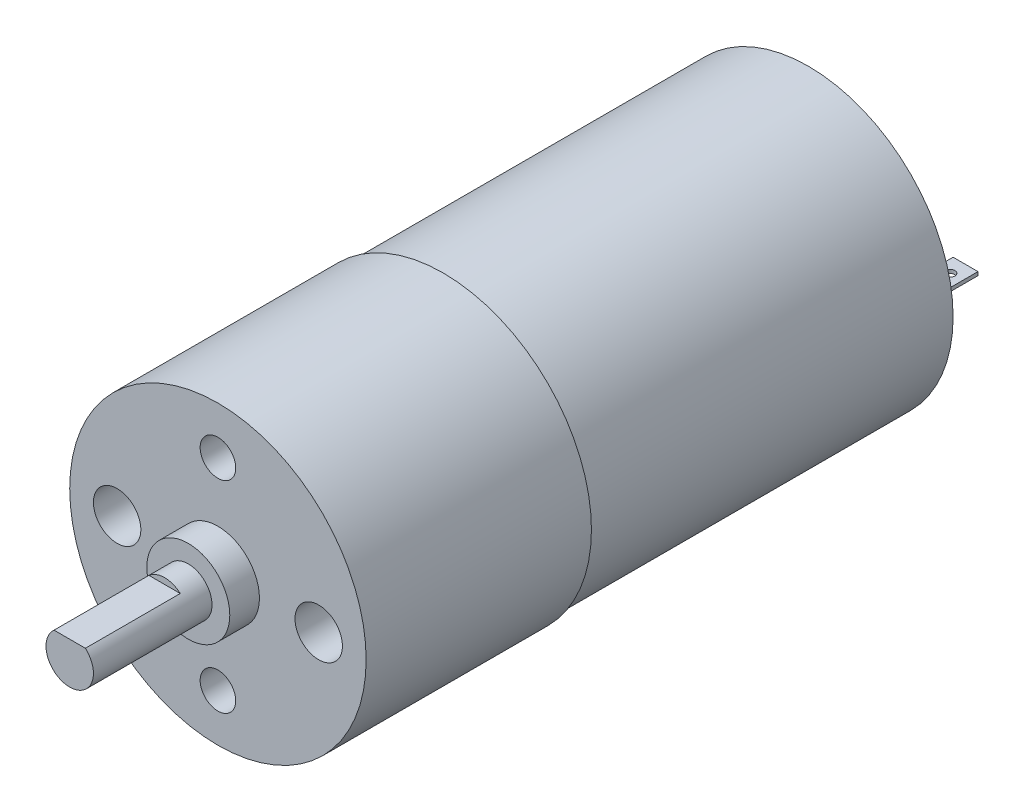
ISO-10303-21;
HEADER;
FILE_DESCRIPTION(('STEP AP214'),'2;1');
FILE_NAME('part.step','',(''),(''),'','','');
FILE_SCHEMA(('AUTOMOTIVE_DESIGN { 1 0 10303 214 1 1 1 1 }'));
ENDSEC;
DATA;
#1=APPLICATION_CONTEXT('core data for automotive mechanical design processes');
#2=APPLICATION_PROTOCOL_DEFINITION('international standard','automotive_design',2000,#1);
#3=PRODUCT_CONTEXT('',#1,'mechanical');
#4=PRODUCT('Part','Part','',(#3));
#5=PRODUCT_RELATED_PRODUCT_CATEGORY('part','',(#4));
#6=PRODUCT_DEFINITION_FORMATION('','',#4);
#7=PRODUCT_DEFINITION_CONTEXT('part definition',#1,'design');
#8=PRODUCT_DEFINITION('design','',#6,#7);
#9=PRODUCT_DEFINITION_SHAPE('','',#8);
#10=(LENGTH_UNIT() NAMED_UNIT(*) SI_UNIT(.MILLI.,.METRE.));
#11=(NAMED_UNIT(*) PLANE_ANGLE_UNIT() SI_UNIT($,.RADIAN.));
#12=(NAMED_UNIT(*) SI_UNIT($,.STERADIAN.) SOLID_ANGLE_UNIT());
#13=UNCERTAINTY_MEASURE_WITH_UNIT(LENGTH_MEASURE(1.E-05),#10,'distance_accuracy_value','');
#14=(GEOMETRIC_REPRESENTATION_CONTEXT(3) GLOBAL_UNCERTAINTY_ASSIGNED_CONTEXT((#13)) GLOBAL_UNIT_ASSIGNED_CONTEXT((#10,
#11,#12)) REPRESENTATION_CONTEXT('',''));
#15=CARTESIAN_POINT('',(0.,0.,0.));
#16=DIRECTION('',(0.,0.,1.));
#17=DIRECTION('',(1.,0.,0.));
#18=AXIS2_PLACEMENT_3D('',#15,#16,#17);
#19=CARTESIAN_POINT('',(0.,0.,-31.8));
#20=DIRECTION('',(0.,0.,1.));
#21=DIRECTION('',(1.,0.,0.));
#22=AXIS2_PLACEMENT_3D('',#19,#20,#21);
#23=CYLINDRICAL_SURFACE('',#22,3.2);
#24=CARTESIAN_POINT('',(0.,0.,-31.8));
#25=DIRECTION('',(0.,0.,-1.));
#26=DIRECTION('',(-1.,0.,0.));
#27=AXIS2_PLACEMENT_3D('',#24,#25,#26);
#28=CIRCLE('',#27,3.2);
#29=CARTESIAN_POINT('',(-3.2,0.,-31.8));
#30=VERTEX_POINT('',#29);
#31=EDGE_CURVE('E11',#30,#30,#28,.T.);
#32=ORIENTED_EDGE('',*,*,#31,.F.);
#33=EDGE_LOOP('',(#32));
#34=FACE_BOUND('',#33,.T.);
#35=CARTESIAN_POINT('',(0.,0.,-30.8));
#36=DIRECTION('',(0.,0.,-1.));
#37=DIRECTION('',(-1.,0.,0.));
#38=AXIS2_PLACEMENT_3D('',#35,#36,#37);
#39=CIRCLE('',#38,3.2);
#40=CARTESIAN_POINT('',(-3.2,0.,-30.8));
#41=VERTEX_POINT('',#40);
#42=EDGE_CURVE('E60',#41,#41,#39,.T.);
#43=ORIENTED_EDGE('',*,*,#42,.T.);
#44=EDGE_LOOP('',(#43));
#45=FACE_BOUND('',#44,.T.);
#46=ADVANCED_FACE('F57',(#34,#45),#23,.T.);
#47=CARTESIAN_POINT('',(0.,0.,-30.8));
#48=DIRECTION('',(0.,0.,-1.));
#49=DIRECTION('',(-1.,0.,0.));
#50=AXIS2_PLACEMENT_3D('',#47,#48,#49);
#51=PLANE('',#50);
#52=ORIENTED_EDGE('',*,*,#42,.F.);
#53=EDGE_LOOP('',(#52));
#54=FACE_BOUND('',#53,.T.);
#55=ADVANCED_FACE('F76',(#54),#51,.F.);
#56=CARTESIAN_POINT('',(0.,0.,-31.8));
#57=DIRECTION('',(0.,0.,1.));
#58=DIRECTION('',(-1.,0.,0.));
#59=AXIS2_PLACEMENT_3D('',#56,#57,#58);
#60=CONICAL_SURFACE('',#59,3.2,0.401425727958696);
#61=CARTESIAN_POINT('',(0.,0.,-32.3));
#62=DIRECTION('',(0.,0.,-1.));
#63=DIRECTION('',(-1.,0.,0.));
#64=AXIS2_PLACEMENT_3D('',#61,#62,#63);
#65=CIRCLE('',#64,2.9877625918952);
#66=CARTESIAN_POINT('',(-2.9877625918952,0.,-32.3));
#67=VERTEX_POINT('',#66);
#68=EDGE_CURVE('E67',#67,#67,#65,.T.);
#69=ORIENTED_EDGE('',*,*,#68,.F.);
#70=EDGE_LOOP('',(#69));
#71=FACE_BOUND('',#70,.T.);
#72=ORIENTED_EDGE('',*,*,#31,.T.);
#73=EDGE_LOOP('',(#72));
#74=FACE_BOUND('',#73,.T.);
#75=ADVANCED_FACE('F74',(#71,#74),#60,.T.);
#76=CARTESIAN_POINT('',(0.,0.,-32.3));
#77=DIRECTION('',(0.,0.,-1.));
#78=DIRECTION('',(-1.,0.,0.));
#79=AXIS2_PLACEMENT_3D('',#76,#77,#78);
#80=PLANE('',#79);
#81=ORIENTED_EDGE('',*,*,#68,.T.);
#82=EDGE_LOOP('',(#81));
#83=FACE_BOUND('',#82,.T.);
#84=ADVANCED_FACE('F72',(#83),#80,.T.);
#85=CLOSED_SHELL('',(#46,#55,#75,#84));
#86=MANIFOLD_SOLID_BREP('B2',#85);
#87=CARTESIAN_POINT('',(0.,0.,-30.8));
#88=DIRECTION('',(0.,0.,-1.));
#89=DIRECTION('',(-1.,0.,0.));
#90=AXIS2_PLACEMENT_3D('',#87,#88,#89);
#91=PLANE('',#90);
#92=CARTESIAN_POINT('',(0.,0.,-30.8));
#93=DIRECTION('',(0.,0.,-1.));
#94=DIRECTION('',(-1.,0.,0.));
#95=AXIS2_PLACEMENT_3D('',#92,#93,#94);
#96=CIRCLE('',#95,12.2);
#97=CARTESIAN_POINT('',(12.2,0.,-30.8));
#98=VERTEX_POINT('',#97);
#99=EDGE_CURVE('E313',#98,#98,#96,.T.);
#100=ORIENTED_EDGE('',*,*,#99,.T.);
#101=EDGE_LOOP('',(#100));
#102=FACE_BOUND('',#101,.T.);
#103=CARTESIAN_POINT('',(0.,0.,-30.8));
#104=DIRECTION('',(0.,0.,-1.));
#105=DIRECTION('',(-1.,0.,0.));
#106=AXIS2_PLACEMENT_3D('',#103,#104,#105);
#107=CIRCLE('',#106,3.2);
#108=CARTESIAN_POINT('',(-3.2,0.,-30.8));
#109=VERTEX_POINT('',#108);
#110=EDGE_CURVE('E310',#109,#109,#107,.T.);
#111=ORIENTED_EDGE('',*,*,#110,.F.);
#112=EDGE_LOOP('',(#111));
#113=FACE_BOUND('',#112,.T.);
#114=DIRECTION('',(1.,0.,0.));
#115=VECTOR('',#114,1.);
#116=CARTESIAN_POINT('',(10.1,0.15,-30.8));
#117=LINE('',#116,#115);
#118=CARTESIAN_POINT('',(8.,0.15,-30.8));
#119=VERTEX_POINT('',#118);
#120=CARTESIAN_POINT('',(10.1,0.15,-30.8));
#121=VERTEX_POINT('',#120);
#122=EDGE_CURVE('E295',#119,#121,#117,.T.);
#123=ORIENTED_EDGE('',*,*,#122,.F.);
#124=DIRECTION('',(0.,1.,0.));
#125=VECTOR('',#124,1.);
#126=CARTESIAN_POINT('',(8.,-0.15,-30.8));
#127=LINE('',#126,#125);
#128=CARTESIAN_POINT('',(8.,-0.15,-30.8));
#129=VERTEX_POINT('',#128);
#130=EDGE_CURVE('E274',#129,#119,#127,.T.);
#131=ORIENTED_EDGE('',*,*,#130,.F.);
#132=DIRECTION('',(-1.,0.,0.));
#133=VECTOR('',#132,1.);
#134=CARTESIAN_POINT('',(10.1,-0.15,-30.8));
#135=LINE('',#134,#133);
#136=CARTESIAN_POINT('',(10.1,-0.15,-30.8));
#137=VERTEX_POINT('',#136);
#138=EDGE_CURVE('E286',#137,#129,#135,.T.);
#139=ORIENTED_EDGE('',*,*,#138,.F.);
#140=DIRECTION('',(0.,-1.,0.));
#141=VECTOR('',#140,1.);
#142=CARTESIAN_POINT('',(10.1,-0.15,-30.8));
#143=LINE('',#142,#141);
#144=EDGE_CURVE('E297',#121,#137,#143,.T.);
#145=ORIENTED_EDGE('',*,*,#144,.F.);
#146=EDGE_LOOP('',(#123,#131,#139,#145));
#147=FACE_BOUND('',#146,.T.);
#148=DIRECTION('',(1.,0.,0.));
#149=VECTOR('',#148,1.);
#150=CARTESIAN_POINT('',(-10.1,0.15,-30.8));
#151=LINE('',#150,#149);
#152=CARTESIAN_POINT('',(-10.1,0.15,-30.8));
#153=VERTEX_POINT('',#152);
#154=CARTESIAN_POINT('',(-8.,0.15,-30.8));
#155=VERTEX_POINT('',#154);
#156=EDGE_CURVE('E269',#153,#155,#151,.T.);
#157=ORIENTED_EDGE('',*,*,#156,.F.);
#158=DIRECTION('',(0.,1.,0.));
#159=VECTOR('',#158,1.);
#160=CARTESIAN_POINT('',(-10.1,-0.149999999999998,-30.8));
#161=LINE('',#160,#159);
#162=CARTESIAN_POINT('',(-10.1,-0.149999999999998,-30.8));
#163=VERTEX_POINT('',#162);
#164=EDGE_CURVE('E271',#163,#153,#161,.T.);
#165=ORIENTED_EDGE('',*,*,#164,.F.);
#166=DIRECTION('',(-1.,0.,0.));
#167=VECTOR('',#166,1.);
#168=CARTESIAN_POINT('',(-10.1,-0.149999999999998,-30.8));
#169=LINE('',#168,#167);
#170=CARTESIAN_POINT('',(-8.00000000000001,-0.149999999999998,-30.8));
#171=VERTEX_POINT('',#170);
#172=EDGE_CURVE('E264',#171,#163,#169,.T.);
#173=ORIENTED_EDGE('',*,*,#172,.F.);
#174=DIRECTION('',(0.,-1.,0.));
#175=VECTOR('',#174,1.);
#176=CARTESIAN_POINT('',(-8.00000000000001,-0.149999999999998,-30.8));
#177=LINE('',#176,#175);
#178=EDGE_CURVE('E266',#155,#171,#177,.T.);
#179=ORIENTED_EDGE('',*,*,#178,.F.);
#180=EDGE_LOOP('',(#157,#165,#173,#179));
#181=FACE_BOUND('',#180,.T.);
#182=ADVANCED_FACE('F141',(#102,#113,#147,#181),#91,.T.);
#183=CARTESIAN_POINT('',(0.,0.,19.));
#184=DIRECTION('',(0.,0.,1.));
#185=DIRECTION('',(1.,0.,0.));
#186=AXIS2_PLACEMENT_3D('',#183,#184,#185);
#187=PLANE('',#186);
#188=CARTESIAN_POINT('',(-8.5,0.,19.));
#189=DIRECTION('',(0.,0.,1.));
#190=DIRECTION('',(1.,0.,0.));
#191=AXIS2_PLACEMENT_3D('',#188,#189,#190);
#192=CIRCLE('',#191,2.);
#193=CARTESIAN_POINT('',(-6.5,0.,19.));
#194=VERTEX_POINT('',#193);
#195=EDGE_CURVE('E352',#194,#194,#192,.T.);
#196=ORIENTED_EDGE('',*,*,#195,.F.);
#197=EDGE_LOOP('',(#196));
#198=FACE_BOUND('',#197,.T.);
#199=CARTESIAN_POINT('',(8.5,0.,19.));
#200=DIRECTION('',(0.,0.,1.));
#201=DIRECTION('',(-1.,0.,0.));
#202=AXIS2_PLACEMENT_3D('',#199,#200,#201);
#203=CIRCLE('',#202,2.);
#204=CARTESIAN_POINT('',(6.5,0.,19.));
#205=VERTEX_POINT('',#204);
#206=EDGE_CURVE('E339',#205,#205,#203,.T.);
#207=ORIENTED_EDGE('',*,*,#206,.F.);
#208=EDGE_LOOP('',(#207));
#209=FACE_BOUND('',#208,.T.);
#210=CARTESIAN_POINT('',(0.,0.,19.));
#211=DIRECTION('',(0.,0.,1.));
#212=DIRECTION('',(1.,0.,0.));
#213=AXIS2_PLACEMENT_3D('',#210,#211,#212);
#214=CIRCLE('',#213,3.5);
#215=CARTESIAN_POINT('',(3.5,0.,19.));
#216=VERTEX_POINT('',#215);
#217=EDGE_CURVE('E245',#216,#216,#214,.T.);
#218=ORIENTED_EDGE('',*,*,#217,.F.);
#219=EDGE_LOOP('',(#218));
#220=FACE_BOUND('',#219,.T.);
#221=CARTESIAN_POINT('',(0.,8.5,19.));
#222=DIRECTION('',(0.,0.,1.));
#223=DIRECTION('',(1.,0.,0.));
#224=AXIS2_PLACEMENT_3D('',#221,#222,#223);
#225=CIRCLE('',#224,1.5);
#226=CARTESIAN_POINT('',(1.5,8.5,19.));
#227=VERTEX_POINT('',#226);
#228=EDGE_CURVE('E323',#227,#227,#225,.T.);
#229=ORIENTED_EDGE('',*,*,#228,.F.);
#230=EDGE_LOOP('',(#229));
#231=FACE_BOUND('',#230,.T.);
#232=CARTESIAN_POINT('',(0.,0.,19.));
#233=DIRECTION('',(0.,0.,1.));
#234=DIRECTION('',(1.,0.,0.));
#235=AXIS2_PLACEMENT_3D('',#232,#233,#234);
#236=CIRCLE('',#235,12.5);
#237=CARTESIAN_POINT('',(12.5,0.,19.));
#238=VERTEX_POINT('',#237);
#239=EDGE_CURVE('E150',#238,#238,#236,.T.);
#240=ORIENTED_EDGE('',*,*,#239,.T.);
#241=EDGE_LOOP('',(#240));
#242=FACE_BOUND('',#241,.T.);
#243=CARTESIAN_POINT('',(0.,-8.5,19.));
#244=DIRECTION('',(0.,0.,1.));
#245=DIRECTION('',(-1.,0.,0.));
#246=AXIS2_PLACEMENT_3D('',#243,#244,#245);
#247=CIRCLE('',#246,1.5);
#248=CARTESIAN_POINT('',(-1.5,-8.5,19.));
#249=VERTEX_POINT('',#248);
#250=EDGE_CURVE('E317',#249,#249,#247,.T.);
#251=ORIENTED_EDGE('',*,*,#250,.F.);
#252=EDGE_LOOP('',(#251));
#253=FACE_BOUND('',#252,.T.);
#254=ADVANCED_FACE('F368',(#198,#209,#220,#231,#242,#253),#187,.T.);
#255=CARTESIAN_POINT('',(0.,0.,0.));
#256=DIRECTION('',(0.,0.,1.));
#257=DIRECTION('',(1.,0.,0.));
#258=AXIS2_PLACEMENT_3D('',#255,#256,#257);
#259=PLANE('',#258);
#260=CARTESIAN_POINT('',(0.,0.,0.));
#261=DIRECTION('',(0.,0.,-1.));
#262=DIRECTION('',(-1.,0.,0.));
#263=AXIS2_PLACEMENT_3D('',#260,#261,#262);
#264=CIRCLE('',#263,12.2);
#265=CARTESIAN_POINT('',(12.2,0.,0.));
#266=VERTEX_POINT('',#265);
#267=EDGE_CURVE('E55',#266,#266,#264,.T.);
#268=ORIENTED_EDGE('',*,*,#267,.F.);
#269=EDGE_LOOP('',(#268));
#270=FACE_BOUND('',#269,.T.);
#271=CARTESIAN_POINT('',(0.,0.,0.));
#272=DIRECTION('',(0.,0.,1.));
#273=DIRECTION('',(1.,0.,0.));
#274=AXIS2_PLACEMENT_3D('',#271,#272,#273);
#275=CIRCLE('',#274,12.5);
#276=CARTESIAN_POINT('',(12.5,0.,0.));
#277=VERTEX_POINT('',#276);
#278=EDGE_CURVE('E326',#277,#277,#275,.T.);
#279=ORIENTED_EDGE('',*,*,#278,.F.);
#280=EDGE_LOOP('',(#279));
#281=FACE_BOUND('',#280,.T.);
#282=ADVANCED_FACE('F374',(#270,#281),#259,.F.);
#283=CARTESIAN_POINT('',(0.,0.,19.));
#284=DIRECTION('',(0.,0.,-1.));
#285=DIRECTION('',(-1.,0.,0.));
#286=AXIS2_PLACEMENT_3D('',#283,#284,#285);
#287=CYLINDRICAL_SURFACE('',#286,12.5);
#288=ORIENTED_EDGE('',*,*,#239,.F.);
#289=EDGE_LOOP('',(#288));
#290=FACE_BOUND('',#289,.T.);
#291=ORIENTED_EDGE('',*,*,#278,.T.);
#292=EDGE_LOOP('',(#291));
#293=FACE_BOUND('',#292,.T.);
#294=ADVANCED_FACE('F143',(#290,#293),#287,.T.);
#295=CARTESIAN_POINT('',(0.,0.,19.));
#296=DIRECTION('',(0.,0.,-1.));
#297=DIRECTION('',(-1.,0.,0.));
#298=AXIS2_PLACEMENT_3D('',#295,#296,#297);
#299=CYLINDRICAL_SURFACE('',#298,3.2);
#300=CARTESIAN_POINT('',(0.,0.,19.));
#301=DIRECTION('',(0.,0.,1.));
#302=DIRECTION('',(1.,0.,0.));
#303=AXIS2_PLACEMENT_3D('',#300,#301,#302);
#304=CIRCLE('',#303,3.2);
#305=CARTESIAN_POINT('',(3.2,0.,19.));
#306=VERTEX_POINT('',#305);
#307=EDGE_CURVE('E249',#306,#306,#304,.T.);
#308=ORIENTED_EDGE('',*,*,#307,.T.);
#309=EDGE_LOOP('',(#308));
#310=FACE_BOUND('',#309,.T.);
#311=ORIENTED_EDGE('',*,*,#110,.T.);
#312=EDGE_LOOP('',(#311));
#313=FACE_BOUND('',#312,.T.);
#314=ADVANCED_FACE('F398',(#310,#313),#299,.F.);
#315=CARTESIAN_POINT('',(0.,8.5,19.));
#316=DIRECTION('',(0.,0.,-1.));
#317=DIRECTION('',(-1.,0.,0.));
#318=AXIS2_PLACEMENT_3D('',#315,#316,#317);
#319=CYLINDRICAL_SURFACE('',#318,1.5);
#320=ORIENTED_EDGE('',*,*,#228,.T.);
#321=EDGE_LOOP('',(#320));
#322=FACE_BOUND('',#321,.T.);
#323=CARTESIAN_POINT('',(0.,8.5,0.));
#324=DIRECTION('',(0.,0.,1.));
#325=DIRECTION('',(1.,0.,0.));
#326=AXIS2_PLACEMENT_3D('',#323,#324,#325);
#327=CIRCLE('',#326,1.5);
#328=CARTESIAN_POINT('',(1.5,8.5,0.));
#329=VERTEX_POINT('',#328);
#330=EDGE_CURVE('E320',#329,#329,#327,.T.);
#331=ORIENTED_EDGE('',*,*,#330,.F.);
#332=EDGE_LOOP('',(#331));
#333=FACE_BOUND('',#332,.T.);
#334=ADVANCED_FACE('F394',(#322,#333),#319,.F.);
#335=CARTESIAN_POINT('',(0.,-8.5,19.));
#336=DIRECTION('',(0.,0.,-1.));
#337=DIRECTION('',(-1.,0.,0.));
#338=AXIS2_PLACEMENT_3D('',#335,#336,#337);
#339=CYLINDRICAL_SURFACE('',#338,1.5);
#340=ORIENTED_EDGE('',*,*,#250,.T.);
#341=EDGE_LOOP('',(#340));
#342=FACE_BOUND('',#341,.T.);
#343=CARTESIAN_POINT('',(0.,-8.5,0.));
#344=DIRECTION('',(0.,0.,1.));
#345=DIRECTION('',(-1.,0.,0.));
#346=AXIS2_PLACEMENT_3D('',#343,#344,#345);
#347=CIRCLE('',#346,1.5);
#348=CARTESIAN_POINT('',(-1.5,-8.5,0.));
#349=VERTEX_POINT('',#348);
#350=EDGE_CURVE('E315',#349,#349,#347,.T.);
#351=ORIENTED_EDGE('',*,*,#350,.F.);
#352=EDGE_LOOP('',(#351));
#353=FACE_BOUND('',#352,.T.);
#354=ADVANCED_FACE('F390',(#342,#353),#339,.F.);
#355=CARTESIAN_POINT('',(0.,0.,-30.8));
#356=DIRECTION('',(0.,0.,1.));
#357=DIRECTION('',(1.,0.,0.));
#358=AXIS2_PLACEMENT_3D('',#355,#356,#357);
#359=CYLINDRICAL_SURFACE('',#358,12.2);
#360=CARTESIAN_POINT('',(12.2,0.,-30.8));
#361=CARTESIAN_POINT('',(12.2,0.,-30.4791666666667));
#362=CARTESIAN_POINT('',(12.2,0.,-30.1583333333333));
#363=CARTESIAN_POINT('',(12.2,0.,-29.5166666666667));
#364=CARTESIAN_POINT('',(12.2,0.,-29.1958333333333));
#365=CARTESIAN_POINT('',(12.2,0.,-28.5541666666667));
#366=CARTESIAN_POINT('',(12.2,0.,-28.2333333333333));
#367=CARTESIAN_POINT('',(12.2,0.,-27.5916666666667));
#368=CARTESIAN_POINT('',(12.2,0.,-27.2708333333333));
#369=CARTESIAN_POINT('',(12.2,0.,-26.6291666666667));
#370=CARTESIAN_POINT('',(12.2,0.,-26.3083333333333));
#371=CARTESIAN_POINT('',(12.2,0.,-25.6666666666667));
#372=CARTESIAN_POINT('',(12.2,0.,-25.3458333333333));
#373=CARTESIAN_POINT('',(12.2,0.,-24.7041666666667));
#374=CARTESIAN_POINT('',(12.2,0.,-24.3833333333333));
#375=CARTESIAN_POINT('',(12.2,0.,-23.7416666666667));
#376=CARTESIAN_POINT('',(12.2,0.,-23.4208333333333));
#377=CARTESIAN_POINT('',(12.2,0.,-22.7791666666667));
#378=CARTESIAN_POINT('',(12.2,0.,-22.4583333333333));
#379=CARTESIAN_POINT('',(12.2,0.,-21.8166666666667));
#380=CARTESIAN_POINT('',(12.2,0.,-21.4958333333333));
#381=CARTESIAN_POINT('',(12.2,0.,-20.8541666666667));
#382=CARTESIAN_POINT('',(12.2,0.,-20.5333333333333));
#383=CARTESIAN_POINT('',(12.2,0.,-19.8916666666667));
#384=CARTESIAN_POINT('',(12.2,0.,-19.5708333333333));
#385=CARTESIAN_POINT('',(12.2,0.,-18.9291666666667));
#386=CARTESIAN_POINT('',(12.2,0.,-18.6083333333333));
#387=CARTESIAN_POINT('',(12.2,0.,-17.9666666666667));
#388=CARTESIAN_POINT('',(12.2,0.,-17.6458333333333));
#389=CARTESIAN_POINT('',(12.2,0.,-17.0041666666667));
#390=CARTESIAN_POINT('',(12.2,0.,-16.6833333333333));
#391=CARTESIAN_POINT('',(12.2,0.,-16.0416666666667));
#392=CARTESIAN_POINT('',(12.2,0.,-15.7208333333333));
#393=CARTESIAN_POINT('',(12.2,0.,-15.0791666666667));
#394=CARTESIAN_POINT('',(12.2,0.,-14.7583333333333));
#395=CARTESIAN_POINT('',(12.2,0.,-14.1166666666667));
#396=CARTESIAN_POINT('',(12.2,0.,-13.7958333333333));
#397=CARTESIAN_POINT('',(12.2,0.,-13.1541666666667));
#398=CARTESIAN_POINT('',(12.2,0.,-12.8333333333333));
#399=CARTESIAN_POINT('',(12.2,0.,-12.1916666666667));
#400=CARTESIAN_POINT('',(12.2,0.,-11.8708333333333));
#401=CARTESIAN_POINT('',(12.2,0.,-11.2291666666667));
#402=CARTESIAN_POINT('',(12.2,0.,-10.9083333333333));
#403=CARTESIAN_POINT('',(12.2,0.,-10.2666666666667));
#404=CARTESIAN_POINT('',(12.2,0.,-9.94583333333333));
#405=CARTESIAN_POINT('',(12.2,0.,-9.30416666666667));
#406=CARTESIAN_POINT('',(12.2,0.,-8.98333333333333));
#407=CARTESIAN_POINT('',(12.2,0.,-8.34166666666667));
#408=CARTESIAN_POINT('',(12.2,0.,-8.02083333333333));
#409=CARTESIAN_POINT('',(12.2,0.,-7.37916666666666));
#410=CARTESIAN_POINT('',(12.2,0.,-7.05833333333333));
#411=CARTESIAN_POINT('',(12.2,0.,-6.41666666666666));
#412=CARTESIAN_POINT('',(12.2,0.,-6.09583333333333));
#413=CARTESIAN_POINT('',(12.2,0.,-5.45416666666667));
#414=CARTESIAN_POINT('',(12.2,0.,-5.13333333333333));
#415=CARTESIAN_POINT('',(12.2,0.,-4.49166666666666));
#416=CARTESIAN_POINT('',(12.2,0.,-4.17083333333333));
#417=CARTESIAN_POINT('',(12.2,0.,-3.52916666666666));
#418=CARTESIAN_POINT('',(12.2,0.,-3.20833333333333));
#419=CARTESIAN_POINT('',(12.2,0.,-2.56666666666666));
#420=CARTESIAN_POINT('',(12.2,0.,-2.24583333333333));
#421=CARTESIAN_POINT('',(12.2,0.,-1.60416666666666));
#422=CARTESIAN_POINT('',(12.2,0.,-1.28333333333333));
#423=CARTESIAN_POINT('',(12.2,0.,-0.641666666666664));
#424=CARTESIAN_POINT('',(12.2,0.,-0.32083333333333));
#425=CARTESIAN_POINT('',(12.2,0.,0.));
#426=B_SPLINE_CURVE_WITH_KNOTS('',3,(#360,#361,#362,#363,#364,#365,#366,#367,#368,#369,#370,
#371,#372,#373,#374,#375,#376,#377,#378,#379,#380,#381,#382,#383,#384,#385,#386,#387,#388,#389,
#390,#391,#392,#393,#394,#395,#396,#397,#398,#399,#400,#401,#402,#403,#404,#405,#406,#407,#408,
#409,#410,#411,#412,#413,#414,#415,#416,#417,#418,#419,#420,#421,#422,#423,#424,#425),
.UNSPECIFIED.,.F.,.F.,(4,2,2,2,2,2,2,2,2,2,2,2,2,2,2,2,2,2,2,2,2,2,2,2,2,2,2,2,2,2,2,2,4),(0.,
0.962500000000002,1.925,2.8875,3.85,4.8125,5.775,6.7375,7.7,8.6625,9.625,10.5875,11.55,12.5125,
13.475,14.4375,15.4,16.3625,17.325,18.2875,19.25,20.2125,21.175,22.1375,23.1,24.0625,25.025,
25.9875,26.95,27.9125,28.875,29.8375,30.8),.UNSPECIFIED.);
#427=EDGE_CURVE('BSEAM387',#98,#266,#426,.T.);
#428=ORIENTED_EDGE('',*,*,#99,.F.);
#429=ORIENTED_EDGE('',*,*,#267,.T.);
#430=ORIENTED_EDGE('',*,*,#427,.T.);
#431=ORIENTED_EDGE('',*,*,#427,.F.);
#432=EDGE_LOOP('',(#428,#430,#429,#431));
#433=FACE_BOUND('',#432,.T.);
#434=ADVANCED_FACE('F387',(#433),#359,.T.);
#435=CARTESIAN_POINT('',(0.,0.,0.));
#436=DIRECTION('',(0.,0.,-1.));
#437=DIRECTION('',(-1.,0.,0.));
#438=AXIS2_PLACEMENT_3D('',#435,#436,#437);
#439=PLANE('',#438);
#440=ORIENTED_EDGE('',*,*,#350,.T.);
#441=EDGE_LOOP('',(#440));
#442=FACE_BOUND('',#441,.T.);
#443=ADVANCED_FACE('F385',(#442),#439,.F.);
#444=ORIENTED_EDGE('',*,*,#330,.T.);
#445=EDGE_LOOP('',(#444));
#446=FACE_BOUND('',#445,.T.);
#447=ADVANCED_FACE('F382',(#446),#439,.F.);
#448=CARTESIAN_POINT('',(8.,-0.15,-35.));
#449=DIRECTION('',(1.,0.,0.));
#450=DIRECTION('',(0.,0.,-1.));
#451=AXIS2_PLACEMENT_3D('',#448,#449,#450);
#452=PLANE('',#451);
#453=ORIENTED_EDGE('',*,*,#130,.T.);
#454=DIRECTION('',(0.,0.,1.));
#455=VECTOR('',#454,1.);
#456=CARTESIAN_POINT('',(8.,0.15,-35.));
#457=LINE('',#456,#455);
#458=CARTESIAN_POINT('',(8.,0.15,-35.));
#459=VERTEX_POINT('',#458);
#460=EDGE_CURVE('E308',#459,#119,#457,.T.);
#461=ORIENTED_EDGE('',*,*,#460,.F.);
#462=DIRECTION('',(0.,1.,0.));
#463=VECTOR('',#462,1.);
#464=CARTESIAN_POINT('',(8.,-0.15,-35.));
#465=LINE('',#464,#463);
#466=CARTESIAN_POINT('',(8.,-0.15,-35.));
#467=VERTEX_POINT('',#466);
#468=EDGE_CURVE('E282',#467,#459,#465,.T.);
#469=ORIENTED_EDGE('',*,*,#468,.F.);
#470=DIRECTION('',(0.,0.,1.));
#471=VECTOR('',#470,1.);
#472=CARTESIAN_POINT('',(8.,-0.15,-35.));
#473=LINE('',#472,#471);
#474=EDGE_CURVE('E292',#467,#129,#473,.T.);
#475=ORIENTED_EDGE('',*,*,#474,.T.);
#476=EDGE_LOOP('',(#453,#461,#469,#475));
#477=FACE_BOUND('',#476,.T.);
#478=ADVANCED_FACE('F380',(#477),#452,.F.);
#479=CARTESIAN_POINT('',(10.1,0.15,-35.));
#480=DIRECTION('',(0.,-1.,0.));
#481=DIRECTION('',(0.,0.,-1.));
#482=AXIS2_PLACEMENT_3D('',#479,#480,#481);
#483=PLANE('',#482);
#484=CARTESIAN_POINT('',(9.05,0.15,-33.7));
#485=DIRECTION('',(0.,1.,0.));
#486=DIRECTION('',(0.,0.,1.));
#487=AXIS2_PLACEMENT_3D('',#484,#485,#486);
#488=CIRCLE('',#487,0.399999999999999);
#489=CARTESIAN_POINT('',(9.05,0.15,-33.3));
#490=VERTEX_POINT('',#489);
#491=EDGE_CURVE('E335',#490,#490,#488,.T.);
#492=ORIENTED_EDGE('',*,*,#491,.F.);
#493=EDGE_LOOP('',(#492));
#494=FACE_BOUND('',#493,.T.);
#495=ORIENTED_EDGE('',*,*,#122,.T.);
#496=DIRECTION('',(0.,0.,1.));
#497=VECTOR('',#496,1.);
#498=CARTESIAN_POINT('',(10.1,0.15,-35.));
#499=LINE('',#498,#497);
#500=CARTESIAN_POINT('',(10.1,0.15,-35.));
#501=VERTEX_POINT('',#500);
#502=EDGE_CURVE('E305',#501,#121,#499,.T.);
#503=ORIENTED_EDGE('',*,*,#502,.F.);
#504=DIRECTION('',(1.,0.,0.));
#505=VECTOR('',#504,1.);
#506=CARTESIAN_POINT('',(10.1,0.15,-35.));
#507=LINE('',#506,#505);
#508=EDGE_CURVE('E285',#459,#501,#507,.T.);
#509=ORIENTED_EDGE('',*,*,#508,.F.);
#510=ORIENTED_EDGE('',*,*,#460,.T.);
#511=EDGE_LOOP('',(#495,#503,#509,#510));
#512=FACE_BOUND('',#511,.T.);
#513=ADVANCED_FACE('F437',(#494,#512),#483,.F.);
#514=CARTESIAN_POINT('',(10.1,-0.15,-35.));
#515=DIRECTION('',(-1.,0.,0.));
#516=DIRECTION('',(0.,0.,1.));
#517=AXIS2_PLACEMENT_3D('',#514,#515,#516);
#518=PLANE('',#517);
#519=ORIENTED_EDGE('',*,*,#144,.T.);
#520=DIRECTION('',(0.,0.,1.));
#521=VECTOR('',#520,1.);
#522=CARTESIAN_POINT('',(10.1,-0.15,-35.));
#523=LINE('',#522,#521);
#524=CARTESIAN_POINT('',(10.1,-0.15,-35.));
#525=VERTEX_POINT('',#524);
#526=EDGE_CURVE('E303',#525,#137,#523,.T.);
#527=ORIENTED_EDGE('',*,*,#526,.F.);
#528=DIRECTION('',(0.,-1.,0.));
#529=VECTOR('',#528,1.);
#530=CARTESIAN_POINT('',(10.1,-0.15,-35.));
#531=LINE('',#530,#529);
#532=EDGE_CURVE('E288',#501,#525,#531,.T.);
#533=ORIENTED_EDGE('',*,*,#532,.F.);
#534=ORIENTED_EDGE('',*,*,#502,.T.);
#535=EDGE_LOOP('',(#519,#527,#533,#534));
#536=FACE_BOUND('',#535,.T.);
#537=ADVANCED_FACE('F444',(#536),#518,.F.);
#538=CARTESIAN_POINT('',(10.1,-0.15,-35.));
#539=DIRECTION('',(0.,1.,0.));
#540=DIRECTION('',(0.,0.,1.));
#541=AXIS2_PLACEMENT_3D('',#538,#539,#540);
#542=PLANE('',#541);
#543=CARTESIAN_POINT('',(9.05,-0.15,-33.7));
#544=DIRECTION('',(0.,1.,0.));
#545=DIRECTION('',(0.,0.,1.));
#546=AXIS2_PLACEMENT_3D('',#543,#544,#545);
#547=CIRCLE('',#546,0.399999999999999);
#548=CARTESIAN_POINT('',(9.05,-0.15,-33.3));
#549=VERTEX_POINT('',#548);
#550=EDGE_CURVE('E332',#549,#549,#547,.T.);
#551=ORIENTED_EDGE('',*,*,#550,.T.);
#552=EDGE_LOOP('',(#551));
#553=FACE_BOUND('',#552,.T.);
#554=ORIENTED_EDGE('',*,*,#138,.T.);
#555=ORIENTED_EDGE('',*,*,#474,.F.);
#556=DIRECTION('',(-1.,0.,0.));
#557=VECTOR('',#556,1.);
#558=CARTESIAN_POINT('',(10.1,-0.15,-35.));
#559=LINE('',#558,#557);
#560=EDGE_CURVE('E290',#525,#467,#559,.T.);
#561=ORIENTED_EDGE('',*,*,#560,.F.);
#562=ORIENTED_EDGE('',*,*,#526,.T.);
#563=EDGE_LOOP('',(#554,#555,#561,#562));
#564=FACE_BOUND('',#563,.T.);
#565=ADVANCED_FACE('F451',(#553,#564),#542,.F.);
#566=CARTESIAN_POINT('',(0.,0.,-35.));
#567=DIRECTION('',(0.,0.,1.));
#568=DIRECTION('',(1.,0.,0.));
#569=AXIS2_PLACEMENT_3D('',#566,#567,#568);
#570=PLANE('',#569);
#571=ORIENTED_EDGE('',*,*,#468,.T.);
#572=ORIENTED_EDGE('',*,*,#508,.T.);
#573=ORIENTED_EDGE('',*,*,#532,.T.);
#574=ORIENTED_EDGE('',*,*,#560,.T.);
#575=EDGE_LOOP('',(#571,#572,#573,#574));
#576=FACE_BOUND('',#575,.T.);
#577=ADVANCED_FACE('F459',(#576),#570,.F.);
#578=CARTESIAN_POINT('',(-10.1,-0.149999999999998,-35.));
#579=DIRECTION('',(1.,0.,0.));
#580=DIRECTION('',(0.,1.,0.));
#581=AXIS2_PLACEMENT_3D('',#578,#579,#580);
#582=PLANE('',#581);
#583=ORIENTED_EDGE('',*,*,#164,.T.);
#584=DIRECTION('',(0.,0.,1.));
#585=VECTOR('',#584,1.);
#586=CARTESIAN_POINT('',(-10.1,0.15,-35.));
#587=LINE('',#586,#585);
#588=CARTESIAN_POINT('',(-10.1,0.15,-35.));
#589=VERTEX_POINT('',#588);
#590=EDGE_CURVE('E254',#589,#153,#587,.T.);
#591=ORIENTED_EDGE('',*,*,#590,.F.);
#592=DIRECTION('',(0.,1.,0.));
#593=VECTOR('',#592,1.);
#594=CARTESIAN_POINT('',(-10.1,-0.149999999999998,-35.));
#595=LINE('',#594,#593);
#596=CARTESIAN_POINT('',(-10.1,-0.149999999999998,-35.));
#597=VERTEX_POINT('',#596);
#598=EDGE_CURVE('E267',#597,#589,#595,.T.);
#599=ORIENTED_EDGE('',*,*,#598,.F.);
#600=DIRECTION('',(0.,0.,1.));
#601=VECTOR('',#600,1.);
#602=CARTESIAN_POINT('',(-10.1,-0.149999999999998,-35.));
#603=LINE('',#602,#601);
#604=EDGE_CURVE('E260',#597,#163,#603,.T.);
#605=ORIENTED_EDGE('',*,*,#604,.T.);
#606=EDGE_LOOP('',(#583,#591,#599,#605));
#607=FACE_BOUND('',#606,.T.);
#608=ADVANCED_FACE('F466',(#607),#582,.F.);
#609=CARTESIAN_POINT('',(-10.1,0.15,-35.));
#610=DIRECTION('',(0.,-1.,0.));
#611=DIRECTION('',(0.,0.,-1.));
#612=AXIS2_PLACEMENT_3D('',#609,#610,#611);
#613=PLANE('',#612);
#614=CARTESIAN_POINT('',(-9.05,0.15,-33.7));
#615=DIRECTION('',(0.,1.,0.));
#616=DIRECTION('',(0.,0.,1.));
#617=AXIS2_PLACEMENT_3D('',#614,#615,#616);
#618=CIRCLE('',#617,0.399999999999999);
#619=CARTESIAN_POINT('',(-9.05,0.15,-33.3));
#620=VERTEX_POINT('',#619);
#621=EDGE_CURVE('E346',#620,#620,#618,.T.);
#622=ORIENTED_EDGE('',*,*,#621,.F.);
#623=EDGE_LOOP('',(#622));
#624=FACE_BOUND('',#623,.T.);
#625=ORIENTED_EDGE('',*,*,#156,.T.);
#626=DIRECTION('',(0.,0.,1.));
#627=VECTOR('',#626,1.);
#628=CARTESIAN_POINT('',(-8.,0.15,-35.));
#629=LINE('',#628,#627);
#630=CARTESIAN_POINT('',(-8.,0.15,-35.));
#631=VERTEX_POINT('',#630);
#632=EDGE_CURVE('E256',#631,#155,#629,.T.);
#633=ORIENTED_EDGE('',*,*,#632,.F.);
#634=DIRECTION('',(1.,0.,0.));
#635=VECTOR('',#634,1.);
#636=CARTESIAN_POINT('',(-10.1,0.15,-35.));
#637=LINE('',#636,#635);
#638=EDGE_CURVE('E278',#589,#631,#637,.T.);
#639=ORIENTED_EDGE('',*,*,#638,.F.);
#640=ORIENTED_EDGE('',*,*,#590,.T.);
#641=EDGE_LOOP('',(#625,#633,#639,#640));
#642=FACE_BOUND('',#641,.T.);
#643=ADVANCED_FACE('F474',(#624,#642),#613,.F.);
#644=CARTESIAN_POINT('',(-8.00000000000001,-0.149999999999998,-35.));
#645=DIRECTION('',(-1.,0.,0.));
#646=DIRECTION('',(0.,-1.,0.));
#647=AXIS2_PLACEMENT_3D('',#644,#645,#646);
#648=PLANE('',#647);
#649=ORIENTED_EDGE('',*,*,#178,.T.);
#650=DIRECTION('',(0.,0.,1.));
#651=VECTOR('',#650,1.);
#652=CARTESIAN_POINT('',(-8.00000000000001,-0.149999999999998,-35.));
#653=LINE('',#652,#651);
#654=CARTESIAN_POINT('',(-8.00000000000001,-0.149999999999998,-35.));
#655=VERTEX_POINT('',#654);
#656=EDGE_CURVE('E166',#655,#171,#653,.T.);
#657=ORIENTED_EDGE('',*,*,#656,.F.);
#658=DIRECTION('',(0.,-1.,0.));
#659=VECTOR('',#658,1.);
#660=CARTESIAN_POINT('',(-8.00000000000001,-0.149999999999998,-35.));
#661=LINE('',#660,#659);
#662=EDGE_CURVE('E276',#631,#655,#661,.T.);
#663=ORIENTED_EDGE('',*,*,#662,.F.);
#664=ORIENTED_EDGE('',*,*,#632,.T.);
#665=EDGE_LOOP('',(#649,#657,#663,#664));
#666=FACE_BOUND('',#665,.T.);
#667=ADVANCED_FACE('F482',(#666),#648,.F.);
#668=CARTESIAN_POINT('',(-10.1,-0.149999999999998,-35.));
#669=DIRECTION('',(0.,1.,0.));
#670=DIRECTION('',(-1.,0.,0.));
#671=AXIS2_PLACEMENT_3D('',#668,#669,#670);
#672=PLANE('',#671);
#673=CARTESIAN_POINT('',(-9.05,-0.149999999999998,-33.7));
#674=DIRECTION('',(0.,1.,0.));
#675=DIRECTION('',(-1.,0.,0.));
#676=AXIS2_PLACEMENT_3D('',#673,#674,#675);
#677=CIRCLE('',#676,0.399999999999999);
#678=CARTESIAN_POINT('',(-9.45,-0.149999999999998,-33.7));
#679=VERTEX_POINT('',#678);
#680=EDGE_CURVE('E145',#679,#679,#677,.T.);
#681=ORIENTED_EDGE('',*,*,#680,.T.);
#682=EDGE_LOOP('',(#681));
#683=FACE_BOUND('',#682,.T.);
#684=ORIENTED_EDGE('',*,*,#172,.T.);
#685=ORIENTED_EDGE('',*,*,#604,.F.);
#686=DIRECTION('',(-1.,0.,0.));
#687=VECTOR('',#686,1.);
#688=CARTESIAN_POINT('',(-10.1,-0.149999999999998,-35.));
#689=LINE('',#688,#687);
#690=EDGE_CURVE('E263',#655,#597,#689,.T.);
#691=ORIENTED_EDGE('',*,*,#690,.F.);
#692=ORIENTED_EDGE('',*,*,#656,.T.);
#693=EDGE_LOOP('',(#684,#685,#691,#692));
#694=FACE_BOUND('',#693,.T.);
#695=ADVANCED_FACE('F490',(#683,#694),#672,.F.);
#696=CARTESIAN_POINT('',(0.,0.,-35.));
#697=DIRECTION('',(0.,0.,-1.));
#698=DIRECTION('',(-1.,0.,0.));
#699=AXIS2_PLACEMENT_3D('',#696,#697,#698);
#700=PLANE('',#699);
#701=ORIENTED_EDGE('',*,*,#598,.T.);
#702=ORIENTED_EDGE('',*,*,#638,.T.);
#703=ORIENTED_EDGE('',*,*,#662,.T.);
#704=ORIENTED_EDGE('',*,*,#690,.T.);
#705=EDGE_LOOP('',(#701,#702,#703,#704));
#706=FACE_BOUND('',#705,.T.);
#707=ADVANCED_FACE('F498',(#706),#700,.T.);
#708=CARTESIAN_POINT('',(0.,0.,19.));
#709=DIRECTION('',(0.,0.,1.));
#710=DIRECTION('',(1.,0.,0.));
#711=AXIS2_PLACEMENT_3D('',#708,#709,#710);
#712=PLANE('',#711);
#713=ORIENTED_EDGE('',*,*,#307,.F.);
#714=EDGE_LOOP('',(#713));
#715=FACE_BOUND('',#714,.T.);
#716=ADVANCED_FACE('F506',(#715),#712,.F.);
#717=CARTESIAN_POINT('',(0.,0.,21.5));
#718=DIRECTION('',(0.,0.,1.));
#719=DIRECTION('',(1.,0.,0.));
#720=AXIS2_PLACEMENT_3D('',#717,#718,#719);
#721=PLANE('',#720);
#722=CARTESIAN_POINT('',(0.,0.,21.5));
#723=DIRECTION('',(0.,0.,1.));
#724=DIRECTION('',(1.,0.,0.));
#725=AXIS2_PLACEMENT_3D('',#722,#723,#724);
#726=CIRCLE('',#725,3.5);
#727=CARTESIAN_POINT('',(3.5,0.,21.5));
#728=VERTEX_POINT('',#727);
#729=EDGE_CURVE('E246',#728,#728,#726,.T.);
#730=ORIENTED_EDGE('',*,*,#729,.T.);
#731=EDGE_LOOP('',(#730));
#732=FACE_BOUND('',#731,.T.);
#733=CARTESIAN_POINT('',(0.,0.,21.5));
#734=DIRECTION('',(0.,0.,1.));
#735=DIRECTION('',(1.,0.,0.));
#736=AXIS2_PLACEMENT_3D('',#733,#734,#735);
#737=CIRCLE('',#736,2.);
#738=CARTESIAN_POINT('',(2.,0.,21.5));
#739=VERTEX_POINT('',#738);
#740=EDGE_CURVE('E242',#739,#739,#737,.T.);
#741=ORIENTED_EDGE('',*,*,#740,.F.);
#742=EDGE_LOOP('',(#741));
#743=FACE_BOUND('',#742,.T.);
#744=ADVANCED_FACE('F514',(#732,#743),#721,.T.);
#745=CARTESIAN_POINT('',(0.,0.,21.5));
#746=DIRECTION('',(0.,0.,-1.));
#747=DIRECTION('',(-1.,0.,0.));
#748=AXIS2_PLACEMENT_3D('',#745,#746,#747);
#749=CYLINDRICAL_SURFACE('',#748,3.5);
#750=ORIENTED_EDGE('',*,*,#729,.F.);
#751=EDGE_LOOP('',(#750));
#752=FACE_BOUND('',#751,.T.);
#753=ORIENTED_EDGE('',*,*,#217,.T.);
#754=EDGE_LOOP('',(#753));
#755=FACE_BOUND('',#754,.T.);
#756=ADVANCED_FACE('F365',(#752,#755),#749,.T.);
#757=CARTESIAN_POINT('',(0.,0.,31.5));
#758=DIRECTION('',(0.,0.,-1.));
#759=DIRECTION('',(-1.,0.,0.));
#760=AXIS2_PLACEMENT_3D('',#757,#758,#759);
#761=CYLINDRICAL_SURFACE('',#760,2.);
#762=CARTESIAN_POINT('',(0.,0.,31.5));
#763=DIRECTION('',(0.,0.,1.));
#764=DIRECTION('',(1.,0.,0.));
#765=AXIS2_PLACEMENT_3D('',#762,#763,#764);
#766=CIRCLE('',#765,2.);
#767=CARTESIAN_POINT('',(-1.3228756555323,1.5,31.5));
#768=VERTEX_POINT('',#767);
#769=CARTESIAN_POINT('',(1.3228756555323,1.5,31.5));
#770=VERTEX_POINT('',#769);
#771=EDGE_CURVE('E236',#768,#770,#766,.T.);
#772=ORIENTED_EDGE('',*,*,#771,.F.);
#773=DIRECTION('',(0.,0.,1.));
#774=VECTOR('',#773,1.);
#775=CARTESIAN_POINT('',(-1.3228756555323,1.5,23.5));
#776=LINE('',#775,#774);
#777=CARTESIAN_POINT('',(-1.3228756555323,1.5,23.5));
#778=VERTEX_POINT('',#777);
#779=EDGE_CURVE('E158',#778,#768,#776,.T.);
#780=ORIENTED_EDGE('',*,*,#779,.F.);
#781=CARTESIAN_POINT('',(0.,0.,23.5));
#782=DIRECTION('',(0.,0.,1.));
#783=DIRECTION('',(1.,0.,0.));
#784=AXIS2_PLACEMENT_3D('',#781,#782,#783);
#785=CIRCLE('',#784,2.);
#786=CARTESIAN_POINT('',(1.3228756555323,1.5,23.5));
#787=VERTEX_POINT('',#786);
#788=EDGE_CURVE('E222',#787,#778,#785,.T.);
#789=ORIENTED_EDGE('',*,*,#788,.F.);
#790=DIRECTION('',(0.,0.,1.));
#791=VECTOR('',#790,1.);
#792=CARTESIAN_POINT('',(1.3228756555323,1.5,23.5));
#793=LINE('',#792,#791);
#794=EDGE_CURVE('E230',#787,#770,#793,.T.);
#795=ORIENTED_EDGE('',*,*,#794,.T.);
#796=EDGE_LOOP('',(#772,#780,#789,#795));
#797=FACE_BOUND('',#796,.T.);
#798=ORIENTED_EDGE('',*,*,#740,.T.);
#799=EDGE_LOOP('',(#798));
#800=FACE_BOUND('',#799,.T.);
#801=ADVANCED_FACE('F233',(#797,#800),#761,.T.);
#802=CARTESIAN_POINT('',(0.,0.,31.5));
#803=DIRECTION('',(0.,0.,1.));
#804=DIRECTION('',(1.,0.,0.));
#805=AXIS2_PLACEMENT_3D('',#802,#803,#804);
#806=PLANE('',#805);
#807=DIRECTION('',(1.,0.,0.));
#808=VECTOR('',#807,1.);
#809=CARTESIAN_POINT('',(0.,1.5,31.5));
#810=LINE('',#809,#808);
#811=EDGE_CURVE('E227',#768,#770,#810,.T.);
#812=ORIENTED_EDGE('',*,*,#811,.F.);
#813=ORIENTED_EDGE('',*,*,#771,.T.);
#814=EDGE_LOOP('',(#812,#813));
#815=FACE_BOUND('',#814,.T.);
#816=ADVANCED_FACE('F357',(#815),#806,.T.);
#817=CARTESIAN_POINT('',(0.,1.5,23.5));
#818=DIRECTION('',(0.,-1.,0.));
#819=DIRECTION('',(0.,0.,-1.));
#820=AXIS2_PLACEMENT_3D('',#817,#818,#819);
#821=PLANE('',#820);
#822=ORIENTED_EDGE('',*,*,#811,.T.);
#823=ORIENTED_EDGE('',*,*,#794,.F.);
#824=DIRECTION('',(1.,0.,0.));
#825=VECTOR('',#824,1.);
#826=CARTESIAN_POINT('',(0.,1.5,23.5));
#827=LINE('',#826,#825);
#828=EDGE_CURVE('E224',#778,#787,#827,.T.);
#829=ORIENTED_EDGE('',*,*,#828,.F.);
#830=ORIENTED_EDGE('',*,*,#779,.T.);
#831=EDGE_LOOP('',(#822,#823,#829,#830));
#832=FACE_BOUND('',#831,.T.);
#833=ADVANCED_FACE('F229',(#832),#821,.F.);
#834=CARTESIAN_POINT('',(0.,0.,23.5));
#835=DIRECTION('',(0.,0.,1.));
#836=DIRECTION('',(1.,0.,0.));
#837=AXIS2_PLACEMENT_3D('',#834,#835,#836);
#838=PLANE('',#837);
#839=ORIENTED_EDGE('',*,*,#788,.T.);
#840=ORIENTED_EDGE('',*,*,#828,.T.);
#841=EDGE_LOOP('',(#839,#840));
#842=FACE_BOUND('',#841,.T.);
#843=ADVANCED_FACE('F223',(#842),#838,.T.);
#844=CARTESIAN_POINT('',(8.5,0.,13.));
#845=DIRECTION('',(0.,0.,1.));
#846=DIRECTION('',(1.,0.,0.));
#847=AXIS2_PLACEMENT_3D('',#844,#845,#846);
#848=CYLINDRICAL_SURFACE('',#847,2.);
#849=CARTESIAN_POINT('',(8.5,0.,13.));
#850=DIRECTION('',(0.,0.,1.));
#851=DIRECTION('',(-1.,0.,0.));
#852=AXIS2_PLACEMENT_3D('',#849,#850,#851);
#853=CIRCLE('',#852,2.);
#854=CARTESIAN_POINT('',(6.5,0.,13.));
#855=VERTEX_POINT('',#854);
#856=EDGE_CURVE('E334',#855,#855,#853,.T.);
#857=ORIENTED_EDGE('',*,*,#856,.F.);
#858=EDGE_LOOP('',(#857));
#859=FACE_BOUND('',#858,.T.);
#860=ORIENTED_EDGE('',*,*,#206,.T.);
#861=EDGE_LOOP('',(#860));
#862=FACE_BOUND('',#861,.T.);
#863=ADVANCED_FACE('F553',(#859,#862),#848,.F.);
#864=CARTESIAN_POINT('',(8.5,0.,13.));
#865=DIRECTION('',(0.,0.,-1.));
#866=DIRECTION('',(-1.,0.,0.));
#867=AXIS2_PLACEMENT_3D('',#864,#865,#866);
#868=PLANE('',#867);
#869=ORIENTED_EDGE('',*,*,#856,.T.);
#870=EDGE_LOOP('',(#869));
#871=FACE_BOUND('',#870,.T.);
#872=ADVANCED_FACE('F563',(#871),#868,.F.);
#873=CARTESIAN_POINT('',(-8.5,0.,13.));
#874=DIRECTION('',(0.,0.,1.));
#875=DIRECTION('',(1.,0.,0.));
#876=AXIS2_PLACEMENT_3D('',#873,#874,#875);
#877=CYLINDRICAL_SURFACE('',#876,2.);
#878=CARTESIAN_POINT('',(-8.5,0.,13.));
#879=DIRECTION('',(0.,0.,1.));
#880=DIRECTION('',(1.,0.,0.));
#881=AXIS2_PLACEMENT_3D('',#878,#879,#880);
#882=CIRCLE('',#881,2.);
#883=CARTESIAN_POINT('',(-6.5,0.,13.));
#884=VERTEX_POINT('',#883);
#885=EDGE_CURVE('E349',#884,#884,#882,.T.);
#886=ORIENTED_EDGE('',*,*,#885,.F.);
#887=EDGE_LOOP('',(#886));
#888=FACE_BOUND('',#887,.T.);
#889=ORIENTED_EDGE('',*,*,#195,.T.);
#890=EDGE_LOOP('',(#889));
#891=FACE_BOUND('',#890,.T.);
#892=ADVANCED_FACE('F573',(#888,#891),#877,.F.);
#893=CARTESIAN_POINT('',(-8.5,0.,13.));
#894=DIRECTION('',(0.,0.,1.));
#895=DIRECTION('',(1.,0.,0.));
#896=AXIS2_PLACEMENT_3D('',#893,#894,#895);
#897=PLANE('',#896);
#898=ORIENTED_EDGE('',*,*,#885,.T.);
#899=EDGE_LOOP('',(#898));
#900=FACE_BOUND('',#899,.T.);
#901=ADVANCED_FACE('F583',(#900),#897,.T.);
#902=CARTESIAN_POINT('',(9.05,-0.35,-33.7));
#903=DIRECTION('',(0.,1.,0.));
#904=DIRECTION('',(0.,0.,1.));
#905=AXIS2_PLACEMENT_3D('',#902,#903,#904);
#906=CYLINDRICAL_SURFACE('',#905,0.399999999999999);
#907=ORIENTED_EDGE('',*,*,#491,.T.);
#908=EDGE_LOOP('',(#907));
#909=FACE_BOUND('',#908,.T.);
#910=ORIENTED_EDGE('',*,*,#550,.F.);
#911=EDGE_LOOP('',(#910));
#912=FACE_BOUND('',#911,.T.);
#913=ADVANCED_FACE('F593',(#909,#912),#906,.F.);
#914=CARTESIAN_POINT('',(-9.05,-0.35,-33.7));
#915=DIRECTION('',(0.,1.,0.));
#916=DIRECTION('',(0.,0.,1.));
#917=AXIS2_PLACEMENT_3D('',#914,#915,#916);
#918=CYLINDRICAL_SURFACE('',#917,0.399999999999999);
#919=ORIENTED_EDGE('',*,*,#621,.T.);
#920=EDGE_LOOP('',(#919));
#921=FACE_BOUND('',#920,.T.);
#922=ORIENTED_EDGE('',*,*,#680,.F.);
#923=EDGE_LOOP('',(#922));
#924=FACE_BOUND('',#923,.T.);
#925=ADVANCED_FACE('F604',(#921,#924),#918,.F.);
#926=CLOSED_SHELL('',(#182,#254,#282,#294,#314,#334,#354,#434,#443,#447,#478,#513,#537,#565,
#577,#608,#643,#667,#695,#707,#716,#744,#756,#801,#816,#833,#843,#863,#872,#892,#901,#913,#925));
#927=MANIFOLD_SOLID_BREP('B6',#926);
#928=ADVANCED_BREP_SHAPE_REPRESENTATION('',(#18,#86,#927),#14);
#929=SHAPE_DEFINITION_REPRESENTATION(#9,#928);
ENDSEC;
END-ISO-10303-21;
